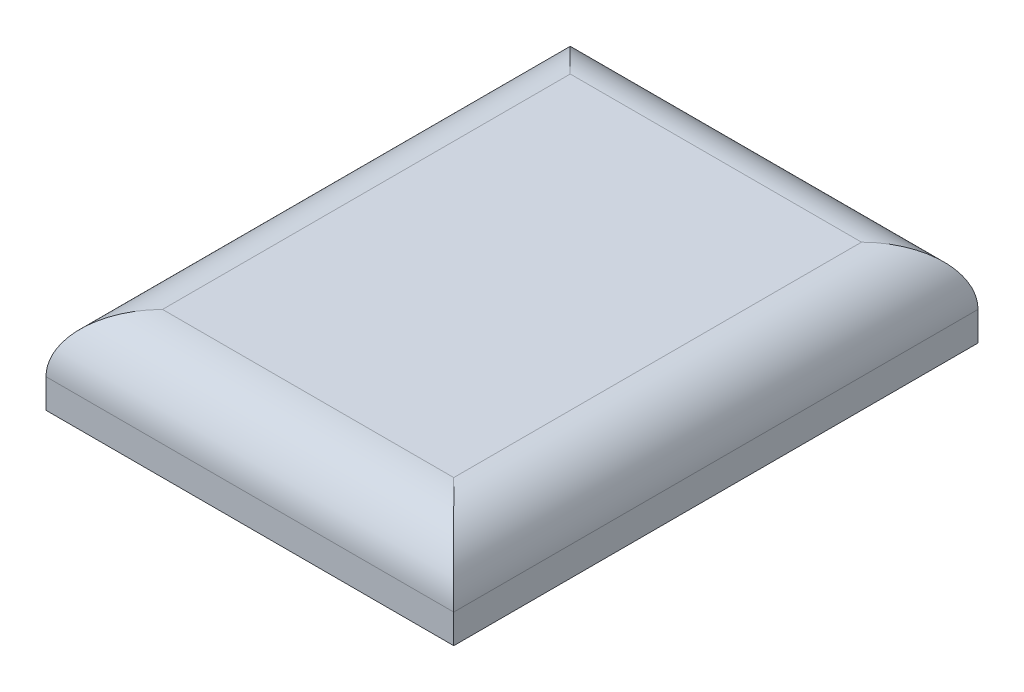
ISO-10303-21;
HEADER;
FILE_DESCRIPTION(('STEP AP214'),'2;1');
FILE_NAME('part.step','',(''),(''),'','','');
FILE_SCHEMA(('AUTOMOTIVE_DESIGN { 1 0 10303 214 1 1 1 1 }'));
ENDSEC;
DATA;
#1=APPLICATION_CONTEXT('core data for automotive mechanical design processes');
#2=APPLICATION_PROTOCOL_DEFINITION('international standard','automotive_design',2000,#1);
#3=PRODUCT_CONTEXT('',#1,'mechanical');
#4=PRODUCT('Part','Part','',(#3));
#5=PRODUCT_RELATED_PRODUCT_CATEGORY('part','',(#4));
#6=PRODUCT_DEFINITION_FORMATION('','',#4);
#7=PRODUCT_DEFINITION_CONTEXT('part definition',#1,'design');
#8=PRODUCT_DEFINITION('design','',#6,#7);
#9=PRODUCT_DEFINITION_SHAPE('','',#8);
#10=(LENGTH_UNIT() NAMED_UNIT(*) SI_UNIT(.MILLI.,.METRE.));
#11=(NAMED_UNIT(*) PLANE_ANGLE_UNIT() SI_UNIT($,.RADIAN.));
#12=(NAMED_UNIT(*) SI_UNIT($,.STERADIAN.) SOLID_ANGLE_UNIT());
#13=UNCERTAINTY_MEASURE_WITH_UNIT(LENGTH_MEASURE(1.E-05),#10,'distance_accuracy_value','');
#14=(GEOMETRIC_REPRESENTATION_CONTEXT(3) GLOBAL_UNCERTAINTY_ASSIGNED_CONTEXT((#13)) GLOBAL_UNIT_ASSIGNED_CONTEXT((#10,
#11,#12)) REPRESENTATION_CONTEXT('',''));
#15=CARTESIAN_POINT('',(0.,0.,0.));
#16=DIRECTION('',(0.,0.,1.));
#17=DIRECTION('',(1.,0.,0.));
#18=AXIS2_PLACEMENT_3D('',#15,#16,#17);
#19=CARTESIAN_POINT('',(35.,15.,45.));
#20=DIRECTION('',(-1.,0.,0.));
#21=DIRECTION('',(0.,0.,1.));
#22=AXIS2_PLACEMENT_3D('',#19,#20,#21);
#23=PLANE('',#22);
#24=DIRECTION('',(0.,-1.,0.));
#25=VECTOR('',#24,1.);
#26=CARTESIAN_POINT('',(35.,15.,-45.));
#27=LINE('',#26,#25);
#28=CARTESIAN_POINT('',(35.,5.,-45.));
#29=VERTEX_POINT('',#28);
#30=CARTESIAN_POINT('',(35.,0.,-45.));
#31=VERTEX_POINT('',#30);
#32=EDGE_CURVE('E93',#29,#31,#27,.T.);
#33=ORIENTED_EDGE('',*,*,#32,.F.);
#34=DIRECTION('',(0.,0.,-1.));
#35=VECTOR('',#34,1.);
#36=CARTESIAN_POINT('',(35.,5.,45.));
#37=LINE('',#36,#35);
#38=CARTESIAN_POINT('',(35.,5.,45.));
#39=VERTEX_POINT('',#38);
#40=EDGE_CURVE('E11',#29,#39,#37,.F.);
#41=ORIENTED_EDGE('',*,*,#40,.T.);
#42=DIRECTION('',(0.,-1.,0.));
#43=VECTOR('',#42,1.);
#44=CARTESIAN_POINT('',(35.,15.,45.));
#45=LINE('',#44,#43);
#46=CARTESIAN_POINT('',(35.,0.,45.));
#47=VERTEX_POINT('',#46);
#48=EDGE_CURVE('E115',#39,#47,#45,.T.);
#49=ORIENTED_EDGE('',*,*,#48,.T.);
#50=DIRECTION('',(0.,0.,-1.));
#51=VECTOR('',#50,1.);
#52=CARTESIAN_POINT('',(35.,0.,45.));
#53=LINE('',#52,#51);
#54=EDGE_CURVE('E110',#47,#31,#53,.T.);
#55=ORIENTED_EDGE('',*,*,#54,.T.);
#56=EDGE_LOOP('',(#33,#41,#49,#55));
#57=FACE_BOUND('',#56,.T.);
#58=ADVANCED_FACE('F39',(#57),#23,.F.);
#59=CARTESIAN_POINT('',(-35.,15.,-45.));
#60=DIRECTION('',(0.,0.,1.));
#61=DIRECTION('',(1.,0.,0.));
#62=AXIS2_PLACEMENT_3D('',#59,#60,#61);
#63=PLANE('',#62);
#64=DIRECTION('',(0.,-1.,0.));
#65=VECTOR('',#64,1.);
#66=CARTESIAN_POINT('',(-35.,15.,-45.));
#67=LINE('',#66,#65);
#68=CARTESIAN_POINT('',(-35.,5.,-45.));
#69=VERTEX_POINT('',#68);
#70=CARTESIAN_POINT('',(-35.,0.,-45.));
#71=VERTEX_POINT('',#70);
#72=EDGE_CURVE('E104',#69,#71,#67,.T.);
#73=ORIENTED_EDGE('',*,*,#72,.F.);
#74=DIRECTION('',(-1.,0.,0.));
#75=VECTOR('',#74,1.);
#76=CARTESIAN_POINT('',(-35.,5.,-45.));
#77=LINE('',#76,#75);
#78=EDGE_CURVE('E100',#69,#29,#77,.F.);
#79=ORIENTED_EDGE('',*,*,#78,.T.);
#80=ORIENTED_EDGE('',*,*,#32,.T.);
#81=DIRECTION('',(-1.,0.,0.));
#82=VECTOR('',#81,1.);
#83=CARTESIAN_POINT('',(-35.,0.,-45.));
#84=LINE('',#83,#82);
#85=EDGE_CURVE('E97',#31,#71,#84,.T.);
#86=ORIENTED_EDGE('',*,*,#85,.T.);
#87=EDGE_LOOP('',(#73,#79,#80,#86));
#88=FACE_BOUND('',#87,.T.);
#89=ADVANCED_FACE('F96',(#88),#63,.F.);
#90=CARTESIAN_POINT('',(-35.,15.,45.));
#91=DIRECTION('',(1.,0.,0.));
#92=DIRECTION('',(0.,0.,-1.));
#93=AXIS2_PLACEMENT_3D('',#90,#91,#92);
#94=PLANE('',#93);
#95=DIRECTION('',(0.,-1.,0.));
#96=VECTOR('',#95,1.);
#97=CARTESIAN_POINT('',(-35.,15.,45.));
#98=LINE('',#97,#96);
#99=CARTESIAN_POINT('',(-35.,5.,45.));
#100=VERTEX_POINT('',#99);
#101=CARTESIAN_POINT('',(-35.,0.,45.));
#102=VERTEX_POINT('',#101);
#103=EDGE_CURVE('E130',#100,#102,#98,.T.);
#104=ORIENTED_EDGE('',*,*,#103,.F.);
#105=DIRECTION('',(0.,0.,1.));
#106=VECTOR('',#105,1.);
#107=CARTESIAN_POINT('',(-35.,5.,45.));
#108=LINE('',#107,#106);
#109=EDGE_CURVE('E149',#100,#69,#108,.F.);
#110=ORIENTED_EDGE('',*,*,#109,.T.);
#111=ORIENTED_EDGE('',*,*,#72,.T.);
#112=DIRECTION('',(0.,0.,1.));
#113=VECTOR('',#112,1.);
#114=CARTESIAN_POINT('',(-35.,0.,45.));
#115=LINE('',#114,#113);
#116=EDGE_CURVE('E112',#71,#102,#115,.T.);
#117=ORIENTED_EDGE('',*,*,#116,.T.);
#118=EDGE_LOOP('',(#104,#110,#111,#117));
#119=FACE_BOUND('',#118,.T.);
#120=ADVANCED_FACE('F190',(#119),#94,.F.);
#121=CARTESIAN_POINT('',(-35.,15.,45.));
#122=DIRECTION('',(0.,0.,-1.));
#123=DIRECTION('',(-1.,0.,0.));
#124=AXIS2_PLACEMENT_3D('',#121,#122,#123);
#125=PLANE('',#124);
#126=ORIENTED_EDGE('',*,*,#48,.F.);
#127=DIRECTION('',(1.,0.,0.));
#128=VECTOR('',#127,1.);
#129=CARTESIAN_POINT('',(-35.,5.,45.));
#130=LINE('',#129,#128);
#131=EDGE_CURVE('E49',#39,#100,#130,.F.);
#132=ORIENTED_EDGE('',*,*,#131,.T.);
#133=ORIENTED_EDGE('',*,*,#103,.T.);
#134=DIRECTION('',(1.,0.,0.));
#135=VECTOR('',#134,1.);
#136=CARTESIAN_POINT('',(-35.,0.,45.));
#137=LINE('',#136,#135);
#138=EDGE_CURVE('E125',#102,#47,#137,.T.);
#139=ORIENTED_EDGE('',*,*,#138,.T.);
#140=EDGE_LOOP('',(#126,#132,#133,#139));
#141=FACE_BOUND('',#140,.T.);
#142=ADVANCED_FACE('F222',(#141),#125,.F.);
#143=CARTESIAN_POINT('',(0.,15.,0.));
#144=DIRECTION('',(0.,-1.,0.));
#145=DIRECTION('',(0.,0.,-1.));
#146=AXIS2_PLACEMENT_3D('',#143,#144,#145);
#147=PLANE('',#146);
#148=DIRECTION('',(0.,0.,-1.));
#149=VECTOR('',#148,1.);
#150=CARTESIAN_POINT('',(25.,15.,0.));
#151=LINE('',#150,#149);
#152=CARTESIAN_POINT('',(25.,15.,35.));
#153=VERTEX_POINT('',#152);
#154=CARTESIAN_POINT('',(25.,15.,-35.));
#155=VERTEX_POINT('',#154);
#156=EDGE_CURVE('E103',#153,#155,#151,.T.);
#157=ORIENTED_EDGE('',*,*,#156,.T.);
#158=DIRECTION('',(-1.,0.,0.));
#159=VECTOR('',#158,1.);
#160=CARTESIAN_POINT('',(0.,15.,-35.));
#161=LINE('',#160,#159);
#162=CARTESIAN_POINT('',(-25.,15.,-35.));
#163=VERTEX_POINT('',#162);
#164=EDGE_CURVE('E143',#155,#163,#161,.T.);
#165=ORIENTED_EDGE('',*,*,#164,.T.);
#166=DIRECTION('',(0.,0.,1.));
#167=VECTOR('',#166,1.);
#168=CARTESIAN_POINT('',(-25.,15.,0.));
#169=LINE('',#168,#167);
#170=CARTESIAN_POINT('',(-25.,15.,35.));
#171=VERTEX_POINT('',#170);
#172=EDGE_CURVE('E140',#163,#171,#169,.T.);
#173=ORIENTED_EDGE('',*,*,#172,.T.);
#174=DIRECTION('',(1.,0.,0.));
#175=VECTOR('',#174,1.);
#176=CARTESIAN_POINT('',(0.,15.,35.));
#177=LINE('',#176,#175);
#178=EDGE_CURVE('E137',#171,#153,#177,.T.);
#179=ORIENTED_EDGE('',*,*,#178,.T.);
#180=EDGE_LOOP('',(#157,#165,#173,#179));
#181=FACE_BOUND('',#180,.T.);
#182=ADVANCED_FACE('F172',(#181),#147,.F.);
#183=CARTESIAN_POINT('',(0.,0.,0.));
#184=DIRECTION('',(0.,-1.,0.));
#185=DIRECTION('',(0.,0.,-1.));
#186=AXIS2_PLACEMENT_3D('',#183,#184,#185);
#187=PLANE('',#186);
#188=ORIENTED_EDGE('',*,*,#54,.F.);
#189=ORIENTED_EDGE('',*,*,#138,.F.);
#190=ORIENTED_EDGE('',*,*,#116,.F.);
#191=ORIENTED_EDGE('',*,*,#85,.F.);
#192=EDGE_LOOP('',(#188,#189,#190,#191));
#193=FACE_BOUND('',#192,.T.);
#194=ADVANCED_FACE('F108',(#193),#187,.T.);
#195=CARTESIAN_POINT('',(0.,5.,35.));
#196=DIRECTION('',(1.,0.,0.));
#197=DIRECTION('',(0.,0.,-1.));
#198=AXIS2_PLACEMENT_3D('',#195,#196,#197);
#199=CYLINDRICAL_SURFACE('',#198,10.);
#200=CARTESIAN_POINT('',(-25.,5.,35.));
#201=DIRECTION('',(0.707106781186547,0.,0.707106781186547));
#202=DIRECTION('',(0.707106781186547,0.,-0.707106781186547));
#203=AXIS2_PLACEMENT_3D('',#200,#201,#202);
#204=ELLIPSE('',#203,14.1421356237309,10.);
#205=EDGE_CURVE('E121',#100,#171,#204,.F.);
#206=ORIENTED_EDGE('',*,*,#205,.F.);
#207=ORIENTED_EDGE('',*,*,#131,.F.);
#208=CARTESIAN_POINT('',(25.,5.,35.));
#209=DIRECTION('',(0.707106781186547,0.,-0.707106781186547));
#210=DIRECTION('',(-0.707106781186547,0.,-0.707106781186547));
#211=AXIS2_PLACEMENT_3D('',#208,#209,#210);
#212=ELLIPSE('',#211,14.1421356237309,10.);
#213=EDGE_CURVE('E43',#153,#39,#212,.T.);
#214=ORIENTED_EDGE('',*,*,#213,.F.);
#215=ORIENTED_EDGE('',*,*,#178,.F.);
#216=EDGE_LOOP('',(#206,#207,#214,#215));
#217=FACE_BOUND('',#216,.T.);
#218=ADVANCED_FACE('F41',(#217),#199,.T.);
#219=CARTESIAN_POINT('',(25.,5.,0.));
#220=DIRECTION('',(0.,0.,-1.));
#221=DIRECTION('',(-1.,0.,0.));
#222=AXIS2_PLACEMENT_3D('',#219,#220,#221);
#223=CYLINDRICAL_SURFACE('',#222,10.);
#224=ORIENTED_EDGE('',*,*,#213,.T.);
#225=ORIENTED_EDGE('',*,*,#40,.F.);
#226=CARTESIAN_POINT('',(25.,5.,-35.));
#227=DIRECTION('',(-0.707106781186547,0.,-0.707106781186547));
#228=DIRECTION('',(0.707106781186547,0.,-0.707106781186547));
#229=AXIS2_PLACEMENT_3D('',#226,#227,#228);
#230=ELLIPSE('',#229,14.1421356237309,10.);
#231=EDGE_CURVE('E157',#155,#29,#230,.T.);
#232=ORIENTED_EDGE('',*,*,#231,.F.);
#233=ORIENTED_EDGE('',*,*,#156,.F.);
#234=EDGE_LOOP('',(#224,#225,#232,#233));
#235=FACE_BOUND('',#234,.T.);
#236=ADVANCED_FACE('F178',(#235),#223,.T.);
#237=CARTESIAN_POINT('',(-25.,5.,0.));
#238=DIRECTION('',(0.,0.,1.));
#239=DIRECTION('',(1.,0.,0.));
#240=AXIS2_PLACEMENT_3D('',#237,#238,#239);
#241=CYLINDRICAL_SURFACE('',#240,10.);
#242=ORIENTED_EDGE('',*,*,#205,.T.);
#243=ORIENTED_EDGE('',*,*,#172,.F.);
#244=CARTESIAN_POINT('',(-25.,5.,-35.));
#245=DIRECTION('',(-0.707106781186547,0.,0.707106781186547));
#246=DIRECTION('',(0.707106781186547,0.,0.707106781186547));
#247=AXIS2_PLACEMENT_3D('',#244,#245,#246);
#248=ELLIPSE('',#247,14.1421356237309,10.);
#249=EDGE_CURVE('E154',#69,#163,#248,.F.);
#250=ORIENTED_EDGE('',*,*,#249,.F.);
#251=ORIENTED_EDGE('',*,*,#109,.F.);
#252=EDGE_LOOP('',(#242,#243,#250,#251));
#253=FACE_BOUND('',#252,.T.);
#254=ADVANCED_FACE('F165',(#253),#241,.T.);
#255=CARTESIAN_POINT('',(0.,5.,-35.));
#256=DIRECTION('',(-1.,0.,0.));
#257=DIRECTION('',(0.,0.,1.));
#258=AXIS2_PLACEMENT_3D('',#255,#256,#257);
#259=CYLINDRICAL_SURFACE('',#258,10.);
#260=ORIENTED_EDGE('',*,*,#231,.T.);
#261=ORIENTED_EDGE('',*,*,#78,.F.);
#262=ORIENTED_EDGE('',*,*,#249,.T.);
#263=ORIENTED_EDGE('',*,*,#164,.F.);
#264=EDGE_LOOP('',(#260,#261,#262,#263));
#265=FACE_BOUND('',#264,.T.);
#266=ADVANCED_FACE('F176',(#265),#259,.T.);
#267=CLOSED_SHELL('',(#58,#89,#120,#142,#182,#194,#218,#236,#254,#266));
#268=MANIFOLD_SOLID_BREP('B2',#267);
#269=ADVANCED_BREP_SHAPE_REPRESENTATION('',(#18,#268),#14);
#270=SHAPE_DEFINITION_REPRESENTATION(#9,#269);
ENDSEC;
END-ISO-10303-21;
